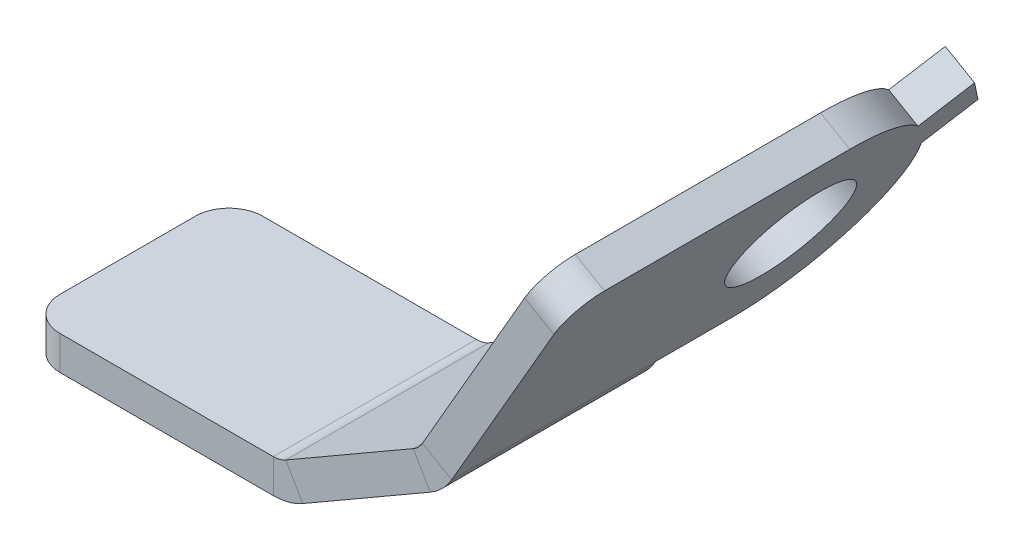
ISO-10303-21;
HEADER;
FILE_DESCRIPTION(('STEP AP214'),'2;1');
FILE_NAME('part.step','',(''),(''),'','','');
FILE_SCHEMA(('AUTOMOTIVE_DESIGN { 1 0 10303 214 1 1 1 1 }'));
ENDSEC;
DATA;
#1=APPLICATION_CONTEXT('core data for automotive mechanical design processes');
#2=APPLICATION_PROTOCOL_DEFINITION('international standard','automotive_design',2000,#1);
#3=PRODUCT_CONTEXT('',#1,'mechanical');
#4=PRODUCT('Part','Part','',(#3));
#5=PRODUCT_RELATED_PRODUCT_CATEGORY('part','',(#4));
#6=PRODUCT_DEFINITION_FORMATION('','',#4);
#7=PRODUCT_DEFINITION_CONTEXT('part definition',#1,'design');
#8=PRODUCT_DEFINITION('design','',#6,#7);
#9=PRODUCT_DEFINITION_SHAPE('','',#8);
#10=(LENGTH_UNIT() NAMED_UNIT(*) SI_UNIT(.MILLI.,.METRE.));
#11=(NAMED_UNIT(*) PLANE_ANGLE_UNIT() SI_UNIT($,.RADIAN.));
#12=(NAMED_UNIT(*) SI_UNIT($,.STERADIAN.) SOLID_ANGLE_UNIT());
#13=UNCERTAINTY_MEASURE_WITH_UNIT(LENGTH_MEASURE(1.E-05),#10,'distance_accuracy_value','');
#14=(GEOMETRIC_REPRESENTATION_CONTEXT(3) GLOBAL_UNCERTAINTY_ASSIGNED_CONTEXT((#13)) GLOBAL_UNIT_ASSIGNED_CONTEXT((#10,
#11,#12)) REPRESENTATION_CONTEXT('',''));
#15=CARTESIAN_POINT('',(0.,0.,0.));
#16=DIRECTION('',(0.,0.,1.));
#17=DIRECTION('',(1.,0.,0.));
#18=AXIS2_PLACEMENT_3D('',#15,#16,#17);
#19=CARTESIAN_POINT('',(-8.48178572108112,-2.38062598838668,-5.));
#20=DIRECTION('',(-0.500000000000001,0.866025403784438,0.));
#21=DIRECTION('',(0.,0.,1.));
#22=AXIS2_PLACEMENT_3D('',#19,#20,#21);
#23=PLANE('',#22);
#24=DIRECTION('',(0.866025403784438,0.500000000000001,0.));
#25=VECTOR('',#24,1.);
#26=CARTESIAN_POINT('',(-8.48178572108112,-2.38062598838667,0.));
#27=LINE('',#26,#25);
#28=CARTESIAN_POINT('',(-2.45544112295243,1.09868568757238,0.));
#29=VERTEX_POINT('',#28);
#30=CARTESIAN_POINT('',(1.31394982251675,3.27494456461996,0.));
#31=VERTEX_POINT('',#30);
#32=EDGE_CURVE('E92',#29,#31,#27,.T.);
#33=ORIENTED_EDGE('',*,*,#32,.T.);
#34=DIRECTION('',(0.,0.,-1.));
#35=VECTOR('',#34,1.);
#36=CARTESIAN_POINT('',(1.31394982251675,3.27494456461996,-5.));
#37=LINE('',#36,#35);
#38=CARTESIAN_POINT('',(1.31394982251675,3.27494456461996,-6.));
#39=VERTEX_POINT('',#38);
#40=EDGE_CURVE('E351',#31,#39,#37,.T.);
#41=ORIENTED_EDGE('',*,*,#40,.T.);
#42=DIRECTION('',(0.866025403784438,0.500000000000001,0.));
#43=VECTOR('',#42,1.);
#44=CARTESIAN_POINT('',(-8.48178572108112,-2.38062598838667,-6.));
#45=LINE('',#44,#43);
#46=CARTESIAN_POINT('',(-2.45544112295243,1.09868568757238,-6.));
#47=VERTEX_POINT('',#46);
#48=EDGE_CURVE('E344',#47,#39,#45,.T.);
#49=ORIENTED_EDGE('',*,*,#48,.F.);
#50=DIRECTION('',(0.,0.,-1.));
#51=VECTOR('',#50,1.);
#52=CARTESIAN_POINT('',(-2.45544112295243,1.09868568757238,-5.));
#53=LINE('',#52,#51);
#54=EDGE_CURVE('E340',#29,#47,#53,.T.);
#55=ORIENTED_EDGE('',*,*,#54,.F.);
#56=EDGE_LOOP('',(#33,#41,#49,#55));
#57=FACE_BOUND('',#56,.T.);
#58=ADVANCED_FACE('F88',(#57),#23,.T.);
#59=CARTESIAN_POINT('',(-8.48178572108112,-2.38062598838667,-6.));
#60=DIRECTION('',(0.,0.,-1.));
#61=DIRECTION('',(-0.866025403784438,-0.500000000000001,0.));
#62=AXIS2_PLACEMENT_3D('',#59,#60,#61);
#63=PLANE('',#62);
#64=ORIENTED_EDGE('',*,*,#48,.T.);
#65=DIRECTION('',(0.500000000000001,-0.866025403784438,0.));
#66=VECTOR('',#65,1.);
#67=CARTESIAN_POINT('',(1.31394982251675,3.27494456461996,-6.));
#68=LINE('',#67,#66);
#69=CARTESIAN_POINT('',(1.81394982251675,2.40891916083552,-6.));
#70=VERTEX_POINT('',#69);
#71=EDGE_CURVE('E12',#39,#70,#68,.T.);
#72=ORIENTED_EDGE('',*,*,#71,.T.);
#73=DIRECTION('',(0.866025403784438,0.500000000000001,0.));
#74=VECTOR('',#73,1.);
#75=CARTESIAN_POINT('',(-7.98178572108112,-3.24665139217111,-6.));
#76=LINE('',#75,#74);
#77=CARTESIAN_POINT('',(-1.95544112295243,0.232660283787945,-6.));
#78=VERTEX_POINT('',#77);
#79=EDGE_CURVE('E359',#78,#70,#76,.T.);
#80=ORIENTED_EDGE('',*,*,#79,.F.);
#81=DIRECTION('',(0.500000000000001,-0.866025403784438,0.));
#82=VECTOR('',#81,1.);
#83=CARTESIAN_POINT('',(-2.45544112295243,1.09868568757238,-6.));
#84=LINE('',#83,#82);
#85=EDGE_CURVE('E343',#47,#78,#84,.T.);
#86=ORIENTED_EDGE('',*,*,#85,.F.);
#87=EDGE_LOOP('',(#64,#72,#80,#86));
#88=FACE_BOUND('',#87,.T.);
#89=ADVANCED_FACE('F90',(#88),#63,.T.);
#90=CARTESIAN_POINT('',(-8.48178572108112,-2.38062598838667,0.));
#91=DIRECTION('',(0.,0.,-1.));
#92=DIRECTION('',(-0.866025403784438,-0.500000000000001,0.));
#93=AXIS2_PLACEMENT_3D('',#90,#91,#92);
#94=PLANE('',#93);
#95=DIRECTION('',(0.500000000000001,-0.866025403784438,0.));
#96=VECTOR('',#95,1.);
#97=CARTESIAN_POINT('',(1.31394982251675,3.27494456461996,0.));
#98=LINE('',#97,#96);
#99=CARTESIAN_POINT('',(1.81394982251676,2.40891916083552,0.));
#100=VERTEX_POINT('',#99);
#101=EDGE_CURVE('E354',#31,#100,#98,.T.);
#102=ORIENTED_EDGE('',*,*,#101,.F.);
#103=ORIENTED_EDGE('',*,*,#32,.F.);
#104=DIRECTION('',(0.500000000000001,-0.866025403784438,0.));
#105=VECTOR('',#104,1.);
#106=CARTESIAN_POINT('',(-2.45544112295243,1.09868568757238,0.));
#107=LINE('',#106,#105);
#108=CARTESIAN_POINT('',(-1.95544112295243,0.232660283787945,0.));
#109=VERTEX_POINT('',#108);
#110=EDGE_CURVE('E349',#29,#109,#107,.T.);
#111=ORIENTED_EDGE('',*,*,#110,.T.);
#112=DIRECTION('',(0.866025403784438,0.500000000000001,0.));
#113=VECTOR('',#112,1.);
#114=CARTESIAN_POINT('',(-7.98178572108112,-3.24665139217111,0.));
#115=LINE('',#114,#113);
#116=EDGE_CURVE('E113',#109,#100,#115,.T.);
#117=ORIENTED_EDGE('',*,*,#116,.T.);
#118=EDGE_LOOP('',(#102,#103,#111,#117));
#119=FACE_BOUND('',#118,.T.);
#120=ADVANCED_FACE('F363',(#119),#94,.F.);
#121=CARTESIAN_POINT('',(-7.98178572108112,-3.24665139217112,-5.));
#122=DIRECTION('',(-0.500000000000001,0.866025403784438,0.));
#123=DIRECTION('',(0.,0.,1.));
#124=AXIS2_PLACEMENT_3D('',#121,#122,#123);
#125=PLANE('',#124);
#126=DIRECTION('',(0.,0.,-1.));
#127=VECTOR('',#126,1.);
#128=CARTESIAN_POINT('',(1.81394982251675,2.40891916083552,-5.));
#129=LINE('',#128,#127);
#130=EDGE_CURVE('E97',#100,#70,#129,.T.);
#131=ORIENTED_EDGE('',*,*,#130,.F.);
#132=ORIENTED_EDGE('',*,*,#116,.F.);
#133=DIRECTION('',(0.,0.,-1.));
#134=VECTOR('',#133,1.);
#135=CARTESIAN_POINT('',(-1.95544112295243,0.232660283787945,-5.));
#136=LINE('',#135,#134);
#137=EDGE_CURVE('E347',#109,#78,#136,.T.);
#138=ORIENTED_EDGE('',*,*,#137,.T.);
#139=ORIENTED_EDGE('',*,*,#79,.T.);
#140=EDGE_LOOP('',(#131,#132,#138,#139));
#141=FACE_BOUND('',#140,.T.);
#142=ADVANCED_FACE('F367',(#141),#125,.F.);
#143=CARTESIAN_POINT('',(-9.13488222896568,1.,-1.));
#144=DIRECTION('',(0.,-1.,0.));
#145=DIRECTION('',(0.,0.,-1.));
#146=AXIS2_PLACEMENT_3D('',#143,#144,#145);
#147=CYLINDRICAL_SURFACE('',#146,1.);
#148=CARTESIAN_POINT('',(-9.13488222896568,0.,-1.));
#149=DIRECTION('',(0.,1.,0.));
#150=DIRECTION('',(0.,0.,1.));
#151=AXIS2_PLACEMENT_3D('',#148,#149,#150);
#152=CIRCLE('',#151,1.);
#153=CARTESIAN_POINT('',(-10.1348822289657,0.,-1.00000000000001));
#154=VERTEX_POINT('',#153);
#155=CARTESIAN_POINT('',(-9.13488222896567,0.,0.));
#156=VERTEX_POINT('',#155);
#157=EDGE_CURVE('E334',#154,#156,#152,.T.);
#158=ORIENTED_EDGE('',*,*,#157,.T.);
#159=DIRECTION('',(0.,-1.,0.));
#160=VECTOR('',#159,1.);
#161=CARTESIAN_POINT('',(-9.13488222896567,1.,0.));
#162=LINE('',#161,#160);
#163=CARTESIAN_POINT('',(-9.13488222896567,1.,0.));
#164=VERTEX_POINT('',#163);
#165=EDGE_CURVE('E296',#164,#156,#162,.T.);
#166=ORIENTED_EDGE('',*,*,#165,.F.);
#167=CARTESIAN_POINT('',(-9.13488222896568,1.,-1.));
#168=DIRECTION('',(0.,1.,0.));
#169=DIRECTION('',(0.,0.,1.));
#170=AXIS2_PLACEMENT_3D('',#167,#168,#169);
#171=CIRCLE('',#170,1.);
#172=CARTESIAN_POINT('',(-10.1348822289657,1.,-1.00000000000001));
#173=VERTEX_POINT('',#172);
#174=EDGE_CURVE('E308',#173,#164,#171,.T.);
#175=ORIENTED_EDGE('',*,*,#174,.F.);
#176=DIRECTION('',(0.,-1.,0.));
#177=VECTOR('',#176,1.);
#178=CARTESIAN_POINT('',(-10.1348822289657,1.,-1.00000000000001));
#179=LINE('',#178,#177);
#180=EDGE_CURVE('E331',#173,#154,#179,.T.);
#181=ORIENTED_EDGE('',*,*,#180,.T.);
#182=EDGE_LOOP('',(#158,#166,#175,#181));
#183=FACE_BOUND('',#182,.T.);
#184=ADVANCED_FACE('F411',(#183),#147,.T.);
#185=CARTESIAN_POINT('',(-10.1348822289657,1.,-4.99999999999999));
#186=DIRECTION('',(1.,0.,0.));
#187=DIRECTION('',(0.,0.,-1.));
#188=AXIS2_PLACEMENT_3D('',#185,#186,#187);
#189=PLANE('',#188);
#190=DIRECTION('',(0.,0.,1.));
#191=VECTOR('',#190,1.);
#192=CARTESIAN_POINT('',(-10.1348822289657,0.,-4.99999999999999));
#193=LINE('',#192,#191);
#194=CARTESIAN_POINT('',(-10.1348822289657,0.,-4.99999999999999));
#195=VERTEX_POINT('',#194);
#196=EDGE_CURVE('E329',#195,#154,#193,.T.);
#197=ORIENTED_EDGE('',*,*,#196,.T.);
#198=ORIENTED_EDGE('',*,*,#180,.F.);
#199=DIRECTION('',(0.,0.,1.));
#200=VECTOR('',#199,1.);
#201=CARTESIAN_POINT('',(-10.1348822289657,1.,-4.99999999999999));
#202=LINE('',#201,#200);
#203=CARTESIAN_POINT('',(-10.1348822289657,1.,-4.99999999999999));
#204=VERTEX_POINT('',#203);
#205=EDGE_CURVE('E310',#204,#173,#202,.T.);
#206=ORIENTED_EDGE('',*,*,#205,.F.);
#207=DIRECTION('',(0.,-1.,0.));
#208=VECTOR('',#207,1.);
#209=CARTESIAN_POINT('',(-10.1348822289657,1.,-4.99999999999999));
#210=LINE('',#209,#208);
#211=EDGE_CURVE('E326',#204,#195,#210,.T.);
#212=ORIENTED_EDGE('',*,*,#211,.T.);
#213=EDGE_LOOP('',(#197,#198,#206,#212));
#214=FACE_BOUND('',#213,.T.);
#215=ADVANCED_FACE('F408',(#214),#189,.F.);
#216=CARTESIAN_POINT('',(-9.13488222896568,1.,-5.));
#217=DIRECTION('',(0.,-1.,0.));
#218=DIRECTION('',(0.,0.,-1.));
#219=AXIS2_PLACEMENT_3D('',#216,#217,#218);
#220=CYLINDRICAL_SURFACE('',#219,1.);
#221=CARTESIAN_POINT('',(-9.13488222896568,0.,-5.));
#222=DIRECTION('',(0.,1.,0.));
#223=DIRECTION('',(0.,0.,1.));
#224=AXIS2_PLACEMENT_3D('',#221,#222,#223);
#225=CIRCLE('',#224,1.);
#226=CARTESIAN_POINT('',(-9.13488222896567,0.,-6.));
#227=VERTEX_POINT('',#226);
#228=EDGE_CURVE('E323',#227,#195,#225,.T.);
#229=ORIENTED_EDGE('',*,*,#228,.T.);
#230=ORIENTED_EDGE('',*,*,#211,.F.);
#231=CARTESIAN_POINT('',(-9.13488222896568,1.,-5.));
#232=DIRECTION('',(0.,1.,0.));
#233=DIRECTION('',(0.,0.,1.));
#234=AXIS2_PLACEMENT_3D('',#231,#232,#233);
#235=CIRCLE('',#234,1.);
#236=CARTESIAN_POINT('',(-9.13488222896567,1.,-6.));
#237=VERTEX_POINT('',#236);
#238=EDGE_CURVE('E312',#237,#204,#235,.T.);
#239=ORIENTED_EDGE('',*,*,#238,.F.);
#240=DIRECTION('',(0.,-1.,0.));
#241=VECTOR('',#240,1.);
#242=CARTESIAN_POINT('',(-9.13488222896567,1.,-6.));
#243=LINE('',#242,#241);
#244=EDGE_CURVE('E321',#237,#227,#243,.T.);
#245=ORIENTED_EDGE('',*,*,#244,.T.);
#246=EDGE_LOOP('',(#229,#230,#239,#245));
#247=FACE_BOUND('',#246,.T.);
#248=ADVANCED_FACE('F403',(#247),#220,.T.);
#249=CARTESIAN_POINT('',(-9.13488222896568,1.,-5.));
#250=DIRECTION('',(0.,1.,0.));
#251=DIRECTION('',(0.,0.,1.));
#252=AXIS2_PLACEMENT_3D('',#249,#250,#251);
#253=PLANE('',#252);
#254=DIRECTION('',(1.,0.,0.));
#255=VECTOR('',#254,1.);
#256=CARTESIAN_POINT('',(-9.13488222896567,1.,0.));
#257=LINE('',#256,#255);
#258=CARTESIAN_POINT('',(-2.82374112295243,1.,0.));
#259=VERTEX_POINT('',#258);
#260=EDGE_CURVE('E318',#164,#259,#257,.T.);
#261=ORIENTED_EDGE('',*,*,#260,.T.);
#262=DIRECTION('',(0.,0.,-1.));
#263=VECTOR('',#262,1.);
#264=CARTESIAN_POINT('',(-2.82374112295243,1.,-5.));
#265=LINE('',#264,#263);
#266=CARTESIAN_POINT('',(-2.82374112295243,1.,-6.));
#267=VERTEX_POINT('',#266);
#268=EDGE_CURVE('E315',#259,#267,#265,.T.);
#269=ORIENTED_EDGE('',*,*,#268,.T.);
#270=DIRECTION('',(1.,0.,0.));
#271=VECTOR('',#270,1.);
#272=CARTESIAN_POINT('',(-9.13488222896567,1.,-6.));
#273=LINE('',#272,#271);
#274=EDGE_CURVE('E305',#237,#267,#273,.T.);
#275=ORIENTED_EDGE('',*,*,#274,.F.);
#276=ORIENTED_EDGE('',*,*,#238,.T.);
#277=ORIENTED_EDGE('',*,*,#205,.T.);
#278=ORIENTED_EDGE('',*,*,#174,.T.);
#279=EDGE_LOOP('',(#261,#269,#275,#276,#277,#278));
#280=FACE_BOUND('',#279,.T.);
#281=ADVANCED_FACE('F393',(#280),#253,.T.);
#282=CARTESIAN_POINT('',(-9.13488222896567,1.,-6.));
#283=DIRECTION('',(0.,0.,-1.));
#284=DIRECTION('',(-1.,0.,0.));
#285=AXIS2_PLACEMENT_3D('',#282,#283,#284);
#286=PLANE('',#285);
#287=ORIENTED_EDGE('',*,*,#274,.T.);
#288=DIRECTION('',(0.,-1.,0.));
#289=VECTOR('',#288,1.);
#290=CARTESIAN_POINT('',(-2.82374112295243,1.,-6.));
#291=LINE('',#290,#289);
#292=CARTESIAN_POINT('',(-2.82374112295243,0.,-6.));
#293=VERTEX_POINT('',#292);
#294=EDGE_CURVE('E302',#267,#293,#291,.T.);
#295=ORIENTED_EDGE('',*,*,#294,.T.);
#296=DIRECTION('',(1.,0.,0.));
#297=VECTOR('',#296,1.);
#298=CARTESIAN_POINT('',(-9.13488222896567,0.,-6.));
#299=LINE('',#298,#297);
#300=EDGE_CURVE('E299',#227,#293,#299,.T.);
#301=ORIENTED_EDGE('',*,*,#300,.F.);
#302=ORIENTED_EDGE('',*,*,#244,.F.);
#303=EDGE_LOOP('',(#287,#295,#301,#302));
#304=FACE_BOUND('',#303,.T.);
#305=ADVANCED_FACE('F397',(#304),#286,.T.);
#306=CARTESIAN_POINT('',(-9.13488222896568,0.,-5.));
#307=DIRECTION('',(0.,1.,0.));
#308=DIRECTION('',(0.,0.,1.));
#309=AXIS2_PLACEMENT_3D('',#306,#307,#308);
#310=PLANE('',#309);
#311=DIRECTION('',(0.,0.,-1.));
#312=VECTOR('',#311,1.);
#313=CARTESIAN_POINT('',(-2.82374112295243,0.,-5.));
#314=LINE('',#313,#312);
#315=CARTESIAN_POINT('',(-2.82374112295243,0.,0.));
#316=VERTEX_POINT('',#315);
#317=EDGE_CURVE('E336',#316,#293,#314,.T.);
#318=ORIENTED_EDGE('',*,*,#317,.F.);
#319=DIRECTION('',(1.,0.,0.));
#320=VECTOR('',#319,1.);
#321=CARTESIAN_POINT('',(-9.13488222896567,0.,0.));
#322=LINE('',#321,#320);
#323=EDGE_CURVE('E293',#156,#316,#322,.T.);
#324=ORIENTED_EDGE('',*,*,#323,.F.);
#325=ORIENTED_EDGE('',*,*,#157,.F.);
#326=ORIENTED_EDGE('',*,*,#196,.F.);
#327=ORIENTED_EDGE('',*,*,#228,.F.);
#328=ORIENTED_EDGE('',*,*,#300,.T.);
#329=EDGE_LOOP('',(#318,#324,#325,#326,#327,#328));
#330=FACE_BOUND('',#329,.T.);
#331=ADVANCED_FACE('F554',(#330),#310,.F.);
#332=CARTESIAN_POINT('',(-9.13488222896567,1.,0.));
#333=DIRECTION('',(0.,0.,-1.));
#334=DIRECTION('',(-1.,0.,0.));
#335=AXIS2_PLACEMENT_3D('',#332,#333,#334);
#336=PLANE('',#335);
#337=DIRECTION('',(0.,-1.,0.));
#338=VECTOR('',#337,1.);
#339=CARTESIAN_POINT('',(-2.82374112295243,1.,0.));
#340=LINE('',#339,#338);
#341=EDGE_CURVE('E289',#259,#316,#340,.T.);
#342=ORIENTED_EDGE('',*,*,#341,.F.);
#343=ORIENTED_EDGE('',*,*,#260,.F.);
#344=ORIENTED_EDGE('',*,*,#165,.T.);
#345=ORIENTED_EDGE('',*,*,#323,.T.);
#346=EDGE_LOOP('',(#342,#343,#344,#345));
#347=FACE_BOUND('',#346,.T.);
#348=ADVANCED_FACE('F414',(#347),#336,.F.);
#349=CARTESIAN_POINT('',(-2.82374112295243,1.7366,0.));
#350=DIRECTION('',(0.,0.,-1.));
#351=DIRECTION('',(-1.,0.,0.));
#352=AXIS2_PLACEMENT_3D('',#349,#350,#351);
#353=PLANE('',#352);
#354=ORIENTED_EDGE('',*,*,#341,.T.);
#355=CARTESIAN_POINT('',(-2.82374112295243,1.7366,0.));
#356=DIRECTION('',(0.,0.,-1.));
#357=DIRECTION('',(-1.,0.,0.));
#358=AXIS2_PLACEMENT_3D('',#355,#356,#357);
#359=CIRCLE('',#358,1.7366);
#360=EDGE_CURVE('E278',#316,#109,#359,.F.);
#361=ORIENTED_EDGE('',*,*,#360,.T.);
#362=ORIENTED_EDGE('',*,*,#110,.F.);
#363=CARTESIAN_POINT('',(-2.82374112295243,1.7366,0.));
#364=DIRECTION('',(0.,0.,1.));
#365=DIRECTION('',(1.,0.,0.));
#366=AXIS2_PLACEMENT_3D('',#363,#364,#365);
#367=CIRCLE('',#366,0.7366);
#368=EDGE_CURVE('E282',#259,#29,#367,.T.);
#369=ORIENTED_EDGE('',*,*,#368,.F.);
#370=EDGE_LOOP('',(#354,#361,#362,#369));
#371=FACE_BOUND('',#370,.T.);
#372=ADVANCED_FACE('F386',(#371),#353,.F.);
#373=CARTESIAN_POINT('',(-2.82374112295243,1.7366,-6.));
#374=DIRECTION('',(0.,0.,1.));
#375=DIRECTION('',(1.,0.,0.));
#376=AXIS2_PLACEMENT_3D('',#373,#374,#375);
#377=PLANE('',#376);
#378=CARTESIAN_POINT('',(-2.82374112295243,1.7366,-6.));
#379=DIRECTION('',(0.,0.,-1.));
#380=DIRECTION('',(-1.,0.,0.));
#381=AXIS2_PLACEMENT_3D('',#378,#379,#380);
#382=CIRCLE('',#381,1.7366);
#383=EDGE_CURVE('E286',#78,#293,#382,.T.);
#384=ORIENTED_EDGE('',*,*,#383,.T.);
#385=ORIENTED_EDGE('',*,*,#294,.F.);
#386=CARTESIAN_POINT('',(-2.82374112295243,1.7366,-6.));
#387=DIRECTION('',(0.,0.,-1.));
#388=DIRECTION('',(1.,0.,0.));
#389=AXIS2_PLACEMENT_3D('',#386,#387,#388);
#390=CIRCLE('',#389,0.7366);
#391=EDGE_CURVE('E285',#47,#267,#390,.T.);
#392=ORIENTED_EDGE('',*,*,#391,.F.);
#393=ORIENTED_EDGE('',*,*,#85,.T.);
#394=EDGE_LOOP('',(#384,#385,#392,#393));
#395=FACE_BOUND('',#394,.T.);
#396=ADVANCED_FACE('F420',(#395),#377,.F.);
#397=CARTESIAN_POINT('',(-2.82374112295243,1.7366,3.11712622550508));
#398=DIRECTION('',(0.,0.,-1.));
#399=DIRECTION('',(-1.,0.,0.));
#400=AXIS2_PLACEMENT_3D('',#397,#398,#399);
#401=CYLINDRICAL_SURFACE('',#400,0.7366);
#402=ORIENTED_EDGE('',*,*,#54,.T.);
#403=ORIENTED_EDGE('',*,*,#391,.T.);
#404=ORIENTED_EDGE('',*,*,#268,.F.);
#405=ORIENTED_EDGE('',*,*,#368,.T.);
#406=EDGE_LOOP('',(#402,#403,#404,#405));
#407=FACE_BOUND('',#406,.T.);
#408=ADVANCED_FACE('F389',(#407),#401,.F.);
#409=CARTESIAN_POINT('',(-2.82374112295243,1.7366,3.11712622550508));
#410=DIRECTION('',(0.,0.,-1.));
#411=DIRECTION('',(-1.,0.,0.));
#412=AXIS2_PLACEMENT_3D('',#409,#410,#411);
#413=CYLINDRICAL_SURFACE('',#412,1.7366);
#414=ORIENTED_EDGE('',*,*,#137,.F.);
#415=ORIENTED_EDGE('',*,*,#360,.F.);
#416=ORIENTED_EDGE('',*,*,#317,.T.);
#417=ORIENTED_EDGE('',*,*,#383,.F.);
#418=EDGE_LOOP('',(#414,#415,#416,#417));
#419=FACE_BOUND('',#418,.T.);
#420=ADVANCED_FACE('F417',(#419),#413,.T.);
#421=CARTESIAN_POINT('',(0.945649822516753,3.91285887704757,0.));
#422=DIRECTION('',(0.,0.,-1.));
#423=DIRECTION('',(0.,1.,0.));
#424=AXIS2_PLACEMENT_3D('',#421,#422,#423);
#425=PLANE('',#424);
#426=ORIENTED_EDGE('',*,*,#101,.T.);
#427=CARTESIAN_POINT('',(0.945649822516753,3.91285887704757,0.));
#428=DIRECTION('',(0.,0.,-1.));
#429=DIRECTION('',(0.,1.,0.));
#430=AXIS2_PLACEMENT_3D('',#427,#428,#429);
#431=CIRCLE('',#430,1.7366);
#432=CARTESIAN_POINT('',(2.44958953872881,3.04455887704758,0.));
#433=VERTEX_POINT('',#432);
#434=EDGE_CURVE('E253',#100,#433,#431,.F.);
#435=ORIENTED_EDGE('',*,*,#434,.T.);
#436=DIRECTION('',(0.86602540378444,-0.499999999999998,0.));
#437=VECTOR('',#436,1.);
#438=CARTESIAN_POINT('',(1.58356413494437,3.54455887704758,0.));
#439=LINE('',#438,#437);
#440=CARTESIAN_POINT('',(1.58356413494437,3.54455887704758,0.));
#441=VERTEX_POINT('',#440);
#442=EDGE_CURVE('E379',#441,#433,#439,.T.);
#443=ORIENTED_EDGE('',*,*,#442,.F.);
#444=CARTESIAN_POINT('',(0.945649822516753,3.91285887704757,0.));
#445=DIRECTION('',(0.,0.,1.));
#446=DIRECTION('',(0.,-1.,0.));
#447=AXIS2_PLACEMENT_3D('',#444,#445,#446);
#448=CIRCLE('',#447,0.7366);
#449=EDGE_CURVE('E272',#31,#441,#448,.T.);
#450=ORIENTED_EDGE('',*,*,#449,.F.);
#451=EDGE_LOOP('',(#426,#435,#443,#450));
#452=FACE_BOUND('',#451,.T.);
#453=ADVANCED_FACE('F376',(#452),#425,.F.);
#454=CARTESIAN_POINT('',(0.945649822516753,3.91285887704757,-6.));
#455=DIRECTION('',(0.,0.,1.));
#456=DIRECTION('',(1.,0.,0.));
#457=AXIS2_PLACEMENT_3D('',#454,#455,#456);
#458=PLANE('',#457);
#459=CARTESIAN_POINT('',(0.945649822516753,3.91285887704757,-6.));
#460=DIRECTION('',(0.,0.,-1.));
#461=DIRECTION('',(0.,1.,0.));
#462=AXIS2_PLACEMENT_3D('',#459,#460,#461);
#463=CIRCLE('',#462,1.7366);
#464=CARTESIAN_POINT('',(2.44958953872881,3.04455887704758,-6.));
#465=VERTEX_POINT('',#464);
#466=EDGE_CURVE('E105',#465,#70,#463,.T.);
#467=ORIENTED_EDGE('',*,*,#466,.T.);
#468=ORIENTED_EDGE('',*,*,#71,.F.);
#469=CARTESIAN_POINT('',(0.945649822516753,3.91285887704757,-6.));
#470=DIRECTION('',(0.,0.,-1.));
#471=DIRECTION('',(1.,0.,0.));
#472=AXIS2_PLACEMENT_3D('',#469,#470,#471);
#473=CIRCLE('',#472,0.7366);
#474=CARTESIAN_POINT('',(1.58356413494437,3.54455887704758,-6.));
#475=VERTEX_POINT('',#474);
#476=EDGE_CURVE('E275',#475,#39,#473,.T.);
#477=ORIENTED_EDGE('',*,*,#476,.F.);
#478=DIRECTION('',(0.86602540378444,-0.499999999999998,0.));
#479=VECTOR('',#478,1.);
#480=CARTESIAN_POINT('',(1.58356413494437,3.54455887704758,-6.));
#481=LINE('',#480,#479);
#482=EDGE_CURVE('E241',#475,#465,#481,.T.);
#483=ORIENTED_EDGE('',*,*,#482,.T.);
#484=EDGE_LOOP('',(#467,#468,#477,#483));
#485=FACE_BOUND('',#484,.T.);
#486=ADVANCED_FACE('F423',(#485),#458,.F.);
#487=CARTESIAN_POINT('',(0.945649822516753,3.91285887704757,3.20811609151021));
#488=DIRECTION('',(0.,0.,-1.));
#489=DIRECTION('',(0.,1.,0.));
#490=AXIS2_PLACEMENT_3D('',#487,#488,#489);
#491=CYLINDRICAL_SURFACE('',#490,0.7366);
#492=DIRECTION('',(0.,0.,-1.));
#493=VECTOR('',#492,1.);
#494=CARTESIAN_POINT('',(1.58356413494437,3.54455887704758,-5.));
#495=LINE('',#494,#493);
#496=EDGE_CURVE('E270',#441,#475,#495,.T.);
#497=ORIENTED_EDGE('',*,*,#496,.T.);
#498=ORIENTED_EDGE('',*,*,#476,.T.);
#499=ORIENTED_EDGE('',*,*,#40,.F.);
#500=ORIENTED_EDGE('',*,*,#449,.T.);
#501=EDGE_LOOP('',(#497,#498,#499,#500));
#502=FACE_BOUND('',#501,.T.);
#503=ADVANCED_FACE('F424',(#502),#491,.F.);
#504=CARTESIAN_POINT('',(0.945649822516753,3.91285887704757,3.20811609151021));
#505=DIRECTION('',(0.,0.,-1.));
#506=DIRECTION('',(0.,1.,0.));
#507=AXIS2_PLACEMENT_3D('',#504,#505,#506);
#508=CYLINDRICAL_SURFACE('',#507,1.7366);
#509=DIRECTION('',(0.,0.,-1.));
#510=VECTOR('',#509,1.);
#511=CARTESIAN_POINT('',(2.44958953872881,3.04455887704758,-5.));
#512=LINE('',#511,#510);
#513=EDGE_CURVE('E373',#433,#465,#512,.T.);
#514=ORIENTED_EDGE('',*,*,#513,.F.);
#515=ORIENTED_EDGE('',*,*,#434,.F.);
#516=ORIENTED_EDGE('',*,*,#130,.T.);
#517=ORIENTED_EDGE('',*,*,#466,.F.);
#518=EDGE_LOOP('',(#514,#515,#516,#517));
#519=FACE_BOUND('',#518,.T.);
#520=ADVANCED_FACE('F371',(#519),#508,.T.);
#521=CARTESIAN_POINT('',(3.35425245898531,6.61148101865549,-8.25061860578912));
#522=DIRECTION('',(0.86602540378444,-0.499999999999998,0.));
#523=DIRECTION('',(0.,0.,-1.));
#524=AXIS2_PLACEMENT_3D('',#521,#522,#523);
#525=CYLINDRICAL_SURFACE('',#524,1.75);
#526=CARTESIAN_POINT('',(3.35425245898531,6.61148101865549,-8.25061860578912));
#527=DIRECTION('',(-0.86602540378444,0.499999999999998,0.));
#528=DIRECTION('',(0.,0.,1.));
#529=AXIS2_PLACEMENT_3D('',#526,#527,#528);
#530=CIRCLE('',#529,1.75);
#531=CARTESIAN_POINT('',(3.35425245898531,6.61148101865549,-6.50061860578912));
#532=VERTEX_POINT('',#531);
#533=EDGE_CURVE('E262',#532,#532,#530,.T.);
#534=ORIENTED_EDGE('',*,*,#533,.T.);
#535=EDGE_LOOP('',(#534));
#536=FACE_BOUND('',#535,.T.);
#537=CARTESIAN_POINT('',(4.22027786276975,6.11148101865549,-8.25061860578912));
#538=DIRECTION('',(-0.86602540378444,0.499999999999998,0.));
#539=DIRECTION('',(0.,0.,1.));
#540=AXIS2_PLACEMENT_3D('',#537,#538,#539);
#541=CIRCLE('',#540,1.75);
#542=CARTESIAN_POINT('',(4.22027786276975,6.11148101865549,-6.50061860578912));
#543=VERTEX_POINT('',#542);
#544=EDGE_CURVE('E496',#543,#543,#541,.T.);
#545=ORIENTED_EDGE('',*,*,#544,.F.);
#546=EDGE_LOOP('',(#545));
#547=FACE_BOUND('',#546,.T.);
#548=ADVANCED_FACE('F577',(#536,#547),#525,.F.);
#549=CARTESIAN_POINT('',(1.60425245898532,3.58039210540995,-6.));
#550=DIRECTION('',(-0.499999999999998,-0.86602540378444,0.));
#551=DIRECTION('',(0.,0.,1.));
#552=AXIS2_PLACEMENT_3D('',#549,#550,#551);
#553=PLANE('',#552);
#554=DIRECTION('',(0.,0.,-1.));
#555=VECTOR('',#554,1.);
#556=CARTESIAN_POINT('',(2.47027786276976,3.08039210540995,-6.));
#557=LINE('',#556,#555);
#558=CARTESIAN_POINT('',(2.47027786276976,3.08039210540995,-6.));
#559=VERTEX_POINT('',#558);
#560=CARTESIAN_POINT('',(2.47027786276976,3.08039210540995,-8.25061860578912));
#561=VERTEX_POINT('',#560);
#562=EDGE_CURVE('E252',#559,#561,#557,.T.);
#563=ORIENTED_EDGE('',*,*,#562,.F.);
#564=DIRECTION('',(0.86602540378444,-0.499999999999998,0.));
#565=VECTOR('',#564,1.);
#566=CARTESIAN_POINT('',(1.60425245898532,3.58039210540995,-6.));
#567=LINE('',#566,#565);
#568=CARTESIAN_POINT('',(1.60425245898532,3.58039210540995,-6.));
#569=VERTEX_POINT('',#568);
#570=EDGE_CURVE('E239',#569,#559,#567,.T.);
#571=ORIENTED_EDGE('',*,*,#570,.F.);
#572=DIRECTION('',(0.,0.,-1.));
#573=VECTOR('',#572,1.);
#574=CARTESIAN_POINT('',(1.60425245898532,3.58039210540995,-6.));
#575=LINE('',#574,#573);
#576=CARTESIAN_POINT('',(1.60425245898532,3.58039210540995,-8.25061860578912));
#577=VERTEX_POINT('',#576);
#578=EDGE_CURVE('E250',#569,#577,#575,.T.);
#579=ORIENTED_EDGE('',*,*,#578,.T.);
#580=DIRECTION('',(0.86602540378444,-0.499999999999998,0.));
#581=VECTOR('',#580,1.);
#582=CARTESIAN_POINT('',(1.60425245898532,3.58039210540995,-8.25061860578912));
#583=LINE('',#582,#581);
#584=EDGE_CURVE('E261',#577,#561,#583,.T.);
#585=ORIENTED_EDGE('',*,*,#584,.T.);
#586=EDGE_LOOP('',(#563,#571,#579,#585));
#587=FACE_BOUND('',#586,.T.);
#588=ADVANCED_FACE('F249',(#587),#553,.T.);
#589=CARTESIAN_POINT('',(3.35425245898531,6.61148101865549,-8.25061860578912));
#590=DIRECTION('',(0.86602540378444,-0.499999999999998,0.));
#591=DIRECTION('',(0.,0.,-1.));
#592=AXIS2_PLACEMENT_3D('',#589,#590,#591);
#593=CYLINDRICAL_SURFACE('',#592,3.5);
#594=CARTESIAN_POINT('',(3.35425245898531,6.61148101865549,-8.25061860578912));
#595=DIRECTION('',(0.86602540378444,-0.499999999999998,0.));
#596=DIRECTION('',(0.,0.,-1.));
#597=AXIS2_PLACEMENT_3D('',#594,#595,#596);
#598=CIRCLE('',#597,3.5);
#599=CARTESIAN_POINT('',(3.88416757826473,7.52932092894637,-11.5862984263709));
#600=VERTEX_POINT('',#599);
#601=EDGE_CURVE('E260',#577,#600,#598,.T.);
#602=ORIENTED_EDGE('',*,*,#601,.T.);
#603=DIRECTION('',(-0.86602540378444,0.499999999999998,0.));
#604=VECTOR('',#603,1.);
#605=CARTESIAN_POINT('',(7.2597418932626,5.58043218951277,-11.5862984263709));
#606=LINE('',#605,#604);
#607=CARTESIAN_POINT('',(4.75019298204917,7.02932092894637,-11.5862984263709));
#608=VERTEX_POINT('',#607);
#609=EDGE_CURVE('E478',#608,#600,#606,.T.);
#610=ORIENTED_EDGE('',*,*,#609,.F.);
#611=CARTESIAN_POINT('',(4.22027786276975,6.11148101865549,-8.25061860578912));
#612=DIRECTION('',(0.86602540378444,-0.499999999999998,0.));
#613=DIRECTION('',(0.,0.,-1.));
#614=AXIS2_PLACEMENT_3D('',#611,#612,#613);
#615=CIRCLE('',#614,3.5);
#616=EDGE_CURVE('E488',#561,#608,#615,.T.);
#617=ORIENTED_EDGE('',*,*,#616,.F.);
#618=ORIENTED_EDGE('',*,*,#584,.F.);
#619=EDGE_LOOP('',(#602,#610,#617,#618));
#620=FACE_BOUND('',#619,.T.);
#621=ADVANCED_FACE('F487',(#620),#593,.T.);
#622=CARTESIAN_POINT('',(3.82311619879725,-0.371978119897914,0.318522192450472));
#623=DIRECTION('',(0.433012701892218,0.750000000000001,0.5));
#624=DIRECTION('',(0.249999999999999,0.43301270189222,-0.866025403784438));
#625=AXIS2_PLACEMENT_3D('',#622,#623,#624);
#626=PLANE('',#625);
#627=DIRECTION('',(-0.86602540378444,0.499999999999998,0.));
#628=VECTOR('',#627,1.);
#629=CARTESIAN_POINT('',(7.6347418932626,6.2299512423511,-12.8853365320475));
#630=LINE('',#629,#628);
#631=CARTESIAN_POINT('',(5.12519298204917,7.6788399817847,-12.8853365320475));
#632=VERTEX_POINT('',#631);
#633=CARTESIAN_POINT('',(4.25916757826473,8.1788399817847,-12.8853365320475));
#634=VERTEX_POINT('',#633);
#635=EDGE_CURVE('E470',#632,#634,#630,.T.);
#636=ORIENTED_EDGE('',*,*,#635,.F.);
#637=DIRECTION('',(-0.249999999999999,-0.43301270189222,0.866025403784438));
#638=VECTOR('',#637,1.);
#639=CARTESIAN_POINT('',(1.31356728758383,1.07691061953568,0.318522192450472));
#640=LINE('',#639,#638);
#641=EDGE_CURVE('E456',#632,#608,#640,.T.);
#642=ORIENTED_EDGE('',*,*,#641,.T.);
#643=ORIENTED_EDGE('',*,*,#609,.T.);
#644=DIRECTION('',(0.249999999999999,0.43301270189222,-0.866025403784438));
#645=VECTOR('',#644,1.);
#646=CARTESIAN_POINT('',(0.447541883799386,1.57691061953568,0.318522192450472));
#647=LINE('',#646,#645);
#648=EDGE_CURVE('E475',#600,#634,#647,.T.);
#649=ORIENTED_EDGE('',*,*,#648,.T.);
#650=EDGE_LOOP('',(#636,#642,#643,#649));
#651=FACE_BOUND('',#650,.T.);
#652=ADVANCED_FACE('F482',(#651),#626,.F.);
#653=CARTESIAN_POINT('',(7.3588935829314,5.75216795367544,-13.203858724498));
#654=DIRECTION('',(-0.250000000000001,-0.433012701892223,0.866025403784436));
#655=DIRECTION('',(0.433012701892216,0.749999999999999,0.500000000000004));
#656=AXIS2_PLACEMENT_3D('',#653,#654,#655);
#657=PLANE('',#656);
#658=DIRECTION('',(-0.86602540378444,0.499999999999998,0.));
#659=VECTOR('',#658,1.);
#660=CARTESIAN_POINT('',(8.28426094610092,7.3549512423511,-12.1353365320475));
#661=LINE('',#660,#659);
#662=CARTESIAN_POINT('',(5.77471203488749,8.8038399817847,-12.1353365320475));
#663=VERTEX_POINT('',#662);
#664=CARTESIAN_POINT('',(4.90868663110305,9.3038399817847,-12.1353365320475));
#665=VERTEX_POINT('',#664);
#666=EDGE_CURVE('E462',#663,#665,#661,.T.);
#667=ORIENTED_EDGE('',*,*,#666,.F.);
#668=DIRECTION('',(-0.433012701892216,-0.749999999999999,-0.500000000000004));
#669=VECTOR('',#668,1.);
#670=CARTESIAN_POINT('',(4.84934467171797,7.20105669310904,-13.203858724498));
#671=LINE('',#670,#669);
#672=EDGE_CURVE('E472',#663,#632,#671,.T.);
#673=ORIENTED_EDGE('',*,*,#672,.T.);
#674=ORIENTED_EDGE('',*,*,#635,.T.);
#675=DIRECTION('',(0.433012701892216,0.749999999999999,0.500000000000004));
#676=VECTOR('',#675,1.);
#677=CARTESIAN_POINT('',(3.98331926793353,7.70105669310904,-13.203858724498));
#678=LINE('',#677,#676);
#679=EDGE_CURVE('E467',#634,#665,#678,.T.);
#680=ORIENTED_EDGE('',*,*,#679,.T.);
#681=EDGE_LOOP('',(#667,#673,#674,#680));
#682=FACE_BOUND('',#681,.T.);
#683=ADVANCED_FACE('F519',(#682),#657,.F.);
#684=CARTESIAN_POINT('',(4.47263525163559,0.753021880102104,1.06852219245048));
#685=DIRECTION('',(-0.433012701892218,-0.750000000000001,-0.499999999999999));
#686=DIRECTION('',(-0.249999999999999,-0.433012701892219,0.866025403784439));
#687=AXIS2_PLACEMENT_3D('',#684,#685,#686);
#688=PLANE('',#687);
#689=DIRECTION('',(-0.86602540378444,0.499999999999998,0.));
#690=VECTOR('',#689,1.);
#691=CARTESIAN_POINT('',(7.90926094610092,6.70543218951277,-10.8362984263709));
#692=LINE('',#691,#690);
#693=CARTESIAN_POINT('',(5.3997120348875,8.15432092894637,-10.8362984263709));
#694=VERTEX_POINT('',#693);
#695=CARTESIAN_POINT('',(4.53368663110306,8.65432092894637,-10.8362984263709));
#696=VERTEX_POINT('',#695);
#697=EDGE_CURVE('E457',#694,#696,#692,.T.);
#698=ORIENTED_EDGE('',*,*,#697,.F.);
#699=DIRECTION('',(0.249999999999999,0.433012701892219,-0.866025403784439));
#700=VECTOR('',#699,1.);
#701=CARTESIAN_POINT('',(1.96308634042216,2.2019106195357,1.06852219245048));
#702=LINE('',#701,#700);
#703=EDGE_CURVE('E464',#694,#663,#702,.T.);
#704=ORIENTED_EDGE('',*,*,#703,.T.);
#705=ORIENTED_EDGE('',*,*,#666,.T.);
#706=DIRECTION('',(-0.249999999999999,-0.433012701892219,0.866025403784439));
#707=VECTOR('',#706,1.);
#708=CARTESIAN_POINT('',(1.09706093663772,2.7019106195357,1.06852219245048));
#709=LINE('',#708,#707);
#710=EDGE_CURVE('E460',#665,#696,#709,.T.);
#711=ORIENTED_EDGE('',*,*,#710,.T.);
#712=EDGE_LOOP('',(#698,#704,#705,#711));
#713=FACE_BOUND('',#712,.T.);
#714=ADVANCED_FACE('F516',(#713),#688,.F.);
#715=CARTESIAN_POINT('',(5.97027786276974,9.14256993190103,-8.25061860578912));
#716=VERTEX_POINT('',#715);
#717=EDGE_CURVE('E245',#694,#716,#615,.T.);
#718=ORIENTED_EDGE('',*,*,#717,.F.);
#719=ORIENTED_EDGE('',*,*,#697,.T.);
#720=CARTESIAN_POINT('',(5.1042524589853,9.64256993190103,-8.25061860578912));
#721=VERTEX_POINT('',#720);
#722=EDGE_CURVE('E454',#696,#721,#598,.T.);
#723=ORIENTED_EDGE('',*,*,#722,.T.);
#724=DIRECTION('',(0.86602540378444,-0.499999999999998,0.));
#725=VECTOR('',#724,1.);
#726=CARTESIAN_POINT('',(5.1042524589853,9.64256993190103,-8.25061860578912));
#727=LINE('',#726,#725);
#728=EDGE_CURVE('E451',#721,#716,#727,.T.);
#729=ORIENTED_EDGE('',*,*,#728,.T.);
#730=EDGE_LOOP('',(#718,#719,#723,#729));
#731=FACE_BOUND('',#730,.T.);
#732=ADVANCED_FACE('F514',(#731),#593,.T.);
#733=CARTESIAN_POINT('',(5.1042524589853,9.64256993190102,-6.));
#734=DIRECTION('',(-0.499999999999998,-0.86602540378444,0.));
#735=DIRECTION('',(0.,0.,1.));
#736=AXIS2_PLACEMENT_3D('',#733,#734,#735);
#737=PLANE('',#736);
#738=DIRECTION('',(0.,0.,-1.));
#739=VECTOR('',#738,1.);
#740=CARTESIAN_POINT('',(5.97027786276974,9.14256993190103,-6.));
#741=LINE('',#740,#739);
#742=CARTESIAN_POINT('',(5.97027786276974,9.14256993190103,-1.00000000000001));
#743=VERTEX_POINT('',#742);
#744=EDGE_CURVE('E448',#743,#716,#741,.T.);
#745=ORIENTED_EDGE('',*,*,#744,.T.);
#746=ORIENTED_EDGE('',*,*,#728,.F.);
#747=DIRECTION('',(0.,0.,1.));
#748=VECTOR('',#747,1.);
#749=CARTESIAN_POINT('',(5.1042524589853,9.64256993190102,-6.));
#750=LINE('',#749,#748);
#751=CARTESIAN_POINT('',(5.10425245898531,9.64256993190103,-1.00000000000001));
#752=VERTEX_POINT('',#751);
#753=EDGE_CURVE('E445',#721,#752,#750,.T.);
#754=ORIENTED_EDGE('',*,*,#753,.T.);
#755=DIRECTION('',(0.86602540378444,-0.499999999999998,0.));
#756=VECTOR('',#755,1.);
#757=CARTESIAN_POINT('',(5.10425245898531,9.64256993190103,-1.00000000000001));
#758=LINE('',#757,#756);
#759=EDGE_CURVE('E442',#752,#743,#758,.T.);
#760=ORIENTED_EDGE('',*,*,#759,.T.);
#761=EDGE_LOOP('',(#745,#746,#754,#760));
#762=FACE_BOUND('',#761,.T.);
#763=ADVANCED_FACE('F508',(#762),#737,.F.);
#764=CARTESIAN_POINT('',(4.60425245898531,8.77654452811659,-0.999999999999999));
#765=DIRECTION('',(0.86602540378444,-0.499999999999998,0.));
#766=DIRECTION('',(0.,0.,-1.));
#767=AXIS2_PLACEMENT_3D('',#764,#765,#766);
#768=CYLINDRICAL_SURFACE('',#767,1.);
#769=CARTESIAN_POINT('',(5.47027786276975,8.27654452811658,-0.999999999999999));
#770=DIRECTION('',(-0.86602540378444,0.499999999999998,0.));
#771=DIRECTION('',(0.,0.,1.));
#772=AXIS2_PLACEMENT_3D('',#769,#770,#771);
#773=CIRCLE('',#772,1.);
#774=CARTESIAN_POINT('',(5.47027786276974,8.27654452811658,0.));
#775=VERTEX_POINT('',#774);
#776=EDGE_CURVE('E436',#775,#743,#773,.T.);
#777=ORIENTED_EDGE('',*,*,#776,.T.);
#778=ORIENTED_EDGE('',*,*,#759,.F.);
#779=CARTESIAN_POINT('',(4.60425245898531,8.77654452811659,-0.999999999999999));
#780=DIRECTION('',(-0.86602540378444,0.499999999999998,0.));
#781=DIRECTION('',(0.,0.,1.));
#782=AXIS2_PLACEMENT_3D('',#779,#780,#781);
#783=CIRCLE('',#782,1.);
#784=CARTESIAN_POINT('',(4.6042524589853,8.77654452811658,0.));
#785=VERTEX_POINT('',#784);
#786=EDGE_CURVE('E433',#785,#752,#783,.T.);
#787=ORIENTED_EDGE('',*,*,#786,.F.);
#788=DIRECTION('',(0.86602540378444,-0.499999999999998,0.));
#789=VECTOR('',#788,1.);
#790=CARTESIAN_POINT('',(4.6042524589853,8.77654452811658,0.));
#791=LINE('',#790,#789);
#792=EDGE_CURVE('E431',#785,#775,#791,.T.);
#793=ORIENTED_EDGE('',*,*,#792,.T.);
#794=EDGE_LOOP('',(#777,#778,#787,#793));
#795=FACE_BOUND('',#794,.T.);
#796=ADVANCED_FACE('F502',(#795),#768,.T.);
#797=CARTESIAN_POINT('',(-4.39574754101466,-6.81191274000333,-5.));
#798=DIRECTION('',(-0.86602540378444,0.499999999999998,0.));
#799=DIRECTION('',(0.,0.,1.));
#800=AXIS2_PLACEMENT_3D('',#797,#798,#799);
#801=PLANE('',#800);
#802=ORIENTED_EDGE('',*,*,#496,.F.);
#803=DIRECTION('',(0.499999999999998,0.86602540378444,0.));
#804=VECTOR('',#803,1.);
#805=CARTESIAN_POINT('',(-4.39574754101465,-6.81191274000332,0.));
#806=LINE('',#805,#804);
#807=EDGE_CURVE('E426',#441,#785,#806,.T.);
#808=ORIENTED_EDGE('',*,*,#807,.T.);
#809=ORIENTED_EDGE('',*,*,#786,.T.);
#810=ORIENTED_EDGE('',*,*,#753,.F.);
#811=ORIENTED_EDGE('',*,*,#722,.F.);
#812=ORIENTED_EDGE('',*,*,#710,.F.);
#813=ORIENTED_EDGE('',*,*,#679,.F.);
#814=ORIENTED_EDGE('',*,*,#648,.F.);
#815=ORIENTED_EDGE('',*,*,#601,.F.);
#816=ORIENTED_EDGE('',*,*,#578,.F.);
#817=DIRECTION('',(0.499999999999998,0.86602540378444,0.));
#818=VECTOR('',#817,1.);
#819=CARTESIAN_POINT('',(-4.39574754101465,-6.81191274000332,-6.));
#820=LINE('',#819,#818);
#821=EDGE_CURVE('E236',#475,#569,#820,.T.);
#822=ORIENTED_EDGE('',*,*,#821,.F.);
#823=EDGE_LOOP('',(#802,#808,#809,#810,#811,#812,#813,#814,#815,#816,#822));
#824=FACE_BOUND('',#823,.T.);
#825=ORIENTED_EDGE('',*,*,#533,.F.);
#826=EDGE_LOOP('',(#825));
#827=FACE_BOUND('',#826,.T.);
#828=ADVANCED_FACE('F256',(#824,#827),#801,.T.);
#829=CARTESIAN_POINT('',(-4.39574754101465,-6.81191274000332,0.));
#830=DIRECTION('',(0.,0.,-1.));
#831=DIRECTION('',(-0.499999999999998,-0.86602540378444,0.));
#832=AXIS2_PLACEMENT_3D('',#829,#830,#831);
#833=PLANE('',#832);
#834=ORIENTED_EDGE('',*,*,#807,.F.);
#835=ORIENTED_EDGE('',*,*,#442,.T.);
#836=DIRECTION('',(0.499999999999998,0.86602540378444,0.));
#837=VECTOR('',#836,1.);
#838=CARTESIAN_POINT('',(-3.52972213723021,-7.31191274000332,0.));
#839=LINE('',#838,#837);
#840=EDGE_CURVE('E499',#433,#775,#839,.T.);
#841=ORIENTED_EDGE('',*,*,#840,.T.);
#842=ORIENTED_EDGE('',*,*,#792,.F.);
#843=EDGE_LOOP('',(#834,#835,#841,#842));
#844=FACE_BOUND('',#843,.T.);
#845=ADVANCED_FACE('F429',(#844),#833,.F.);
#846=CARTESIAN_POINT('',(-3.52972213723022,-7.31191274000333,-5.));
#847=DIRECTION('',(-0.86602540378444,0.499999999999998,0.));
#848=DIRECTION('',(0.,0.,1.));
#849=AXIS2_PLACEMENT_3D('',#846,#847,#848);
#850=PLANE('',#849);
#851=ORIENTED_EDGE('',*,*,#544,.T.);
#852=EDGE_LOOP('',(#851));
#853=FACE_BOUND('',#852,.T.);
#854=ORIENTED_EDGE('',*,*,#840,.F.);
#855=ORIENTED_EDGE('',*,*,#513,.T.);
#856=DIRECTION('',(0.499999999999998,0.86602540378444,0.));
#857=VECTOR('',#856,1.);
#858=CARTESIAN_POINT('',(-3.52972213723021,-7.31191274000332,-6.));
#859=LINE('',#858,#857);
#860=EDGE_CURVE('E491',#465,#559,#859,.T.);
#861=ORIENTED_EDGE('',*,*,#860,.T.);
#862=ORIENTED_EDGE('',*,*,#562,.T.);
#863=ORIENTED_EDGE('',*,*,#616,.T.);
#864=ORIENTED_EDGE('',*,*,#641,.F.);
#865=ORIENTED_EDGE('',*,*,#672,.F.);
#866=ORIENTED_EDGE('',*,*,#703,.F.);
#867=ORIENTED_EDGE('',*,*,#717,.T.);
#868=ORIENTED_EDGE('',*,*,#744,.F.);
#869=ORIENTED_EDGE('',*,*,#776,.F.);
#870=EDGE_LOOP('',(#854,#855,#861,#862,#863,#864,#865,#866,#867,#868,#869));
#871=FACE_BOUND('',#870,.T.);
#872=ADVANCED_FACE('F489',(#853,#871),#850,.F.);
#873=CARTESIAN_POINT('',(-4.39574754101465,-6.81191274000332,-6.));
#874=DIRECTION('',(0.,0.,-1.));
#875=DIRECTION('',(-0.499999999999998,-0.86602540378444,0.));
#876=AXIS2_PLACEMENT_3D('',#873,#874,#875);
#877=PLANE('',#876);
#878=ORIENTED_EDGE('',*,*,#482,.F.);
#879=ORIENTED_EDGE('',*,*,#821,.T.);
#880=ORIENTED_EDGE('',*,*,#570,.T.);
#881=ORIENTED_EDGE('',*,*,#860,.F.);
#882=EDGE_LOOP('',(#878,#879,#880,#881));
#883=FACE_BOUND('',#882,.T.);
#884=ADVANCED_FACE('F238',(#883),#877,.T.);
#885=CLOSED_SHELL('',(#58,#89,#120,#142,#184,#215,#248,#281,#305,#331,#348,#372,#396,#408,#420,
#453,#486,#503,#520,#548,#588,#621,#652,#683,#714,#732,#763,#796,#828,#845,#872,#884));
#886=MANIFOLD_SOLID_BREP('B2',#885);
#887=ADVANCED_BREP_SHAPE_REPRESENTATION('',(#18,#886),#14);
#888=SHAPE_DEFINITION_REPRESENTATION(#9,#887);
ENDSEC;
END-ISO-10303-21;
